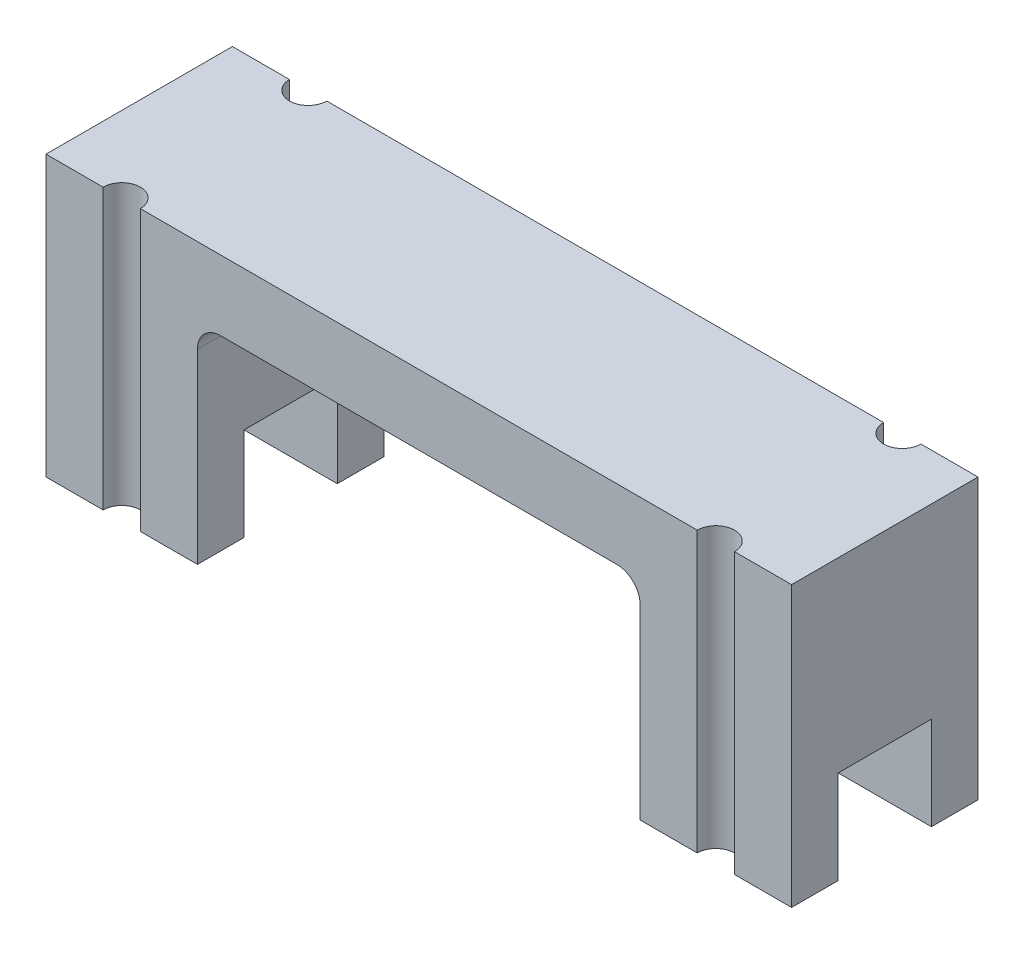
ISO-10303-21;
HEADER;
FILE_DESCRIPTION(('STEP AP214'),'2;1');
FILE_NAME('part.step','',(''),(''),'','','');
FILE_SCHEMA(('AUTOMOTIVE_DESIGN { 1 0 10303 214 1 1 1 1 }'));
ENDSEC;
DATA;
#1=APPLICATION_CONTEXT('core data for automotive mechanical design processes');
#2=APPLICATION_PROTOCOL_DEFINITION('international standard','automotive_design',2000,#1);
#3=PRODUCT_CONTEXT('',#1,'mechanical');
#4=PRODUCT('Part','Part','',(#3));
#5=PRODUCT_RELATED_PRODUCT_CATEGORY('part','',(#4));
#6=PRODUCT_DEFINITION_FORMATION('','',#4);
#7=PRODUCT_DEFINITION_CONTEXT('part definition',#1,'design');
#8=PRODUCT_DEFINITION('design','',#6,#7);
#9=PRODUCT_DEFINITION_SHAPE('','',#8);
#10=(LENGTH_UNIT() NAMED_UNIT(*) SI_UNIT(.MILLI.,.METRE.));
#11=(NAMED_UNIT(*) PLANE_ANGLE_UNIT() SI_UNIT($,.RADIAN.));
#12=(NAMED_UNIT(*) SI_UNIT($,.STERADIAN.) SOLID_ANGLE_UNIT());
#13=UNCERTAINTY_MEASURE_WITH_UNIT(LENGTH_MEASURE(1.E-05),#10,'distance_accuracy_value','');
#14=(GEOMETRIC_REPRESENTATION_CONTEXT(3) GLOBAL_UNCERTAINTY_ASSIGNED_CONTEXT((#13)) GLOBAL_UNIT_ASSIGNED_CONTEXT((#10,
#11,#12)) REPRESENTATION_CONTEXT('',''));
#15=CARTESIAN_POINT('',(0.,0.,0.));
#16=DIRECTION('',(0.,0.,1.));
#17=DIRECTION('',(1.,0.,0.));
#18=AXIS2_PLACEMENT_3D('',#15,#16,#17);
#19=CARTESIAN_POINT('',(-42.5,9.99999999999999,35.));
#20=DIRECTION('',(0.,0.,1.));
#21=DIRECTION('',(1.,0.,0.));
#22=AXIS2_PLACEMENT_3D('',#19,#20,#21);
#23=PLANE('',#22);
#24=DIRECTION('',(-1.,0.,0.));
#25=VECTOR('',#24,1.);
#26=CARTESIAN_POINT('',(80.,30.,35.));
#27=LINE('',#26,#25);
#28=CARTESIAN_POINT('',(80.,30.,35.));
#29=VERTEX_POINT('',#28);
#30=CARTESIAN_POINT('',(67.75,30.,35.));
#31=VERTEX_POINT('',#30);
#32=EDGE_CURVE('E278',#29,#31,#27,.T.);
#33=ORIENTED_EDGE('',*,*,#32,.T.);
#34=DIRECTION('',(0.,1.,0.));
#35=VECTOR('',#34,1.);
#36=CARTESIAN_POINT('',(67.75,-76.,35.));
#37=LINE('',#36,#35);
#38=CARTESIAN_POINT('',(67.75,-30.,35.));
#39=VERTEX_POINT('',#38);
#40=EDGE_CURVE('E11',#31,#39,#37,.F.);
#41=ORIENTED_EDGE('',*,*,#40,.T.);
#42=DIRECTION('',(1.,0.,0.));
#43=VECTOR('',#42,1.);
#44=CARTESIAN_POINT('',(47.5,-30.,35.));
#45=LINE('',#44,#43);
#46=CARTESIAN_POINT('',(80.,-30.,35.));
#47=VERTEX_POINT('',#46);
#48=EDGE_CURVE('E270',#39,#47,#45,.T.);
#49=ORIENTED_EDGE('',*,*,#48,.T.);
#50=DIRECTION('',(0.,1.,0.));
#51=VECTOR('',#50,1.);
#52=CARTESIAN_POINT('',(80.,-30.,35.));
#53=LINE('',#52,#51);
#54=EDGE_CURVE('E274',#47,#29,#53,.T.);
#55=ORIENTED_EDGE('',*,*,#54,.T.);
#56=EDGE_LOOP('',(#33,#41,#49,#55));
#57=FACE_BOUND('',#56,.T.);
#58=ADVANCED_FACE('F35',(#57),#23,.T.);
#59=CARTESIAN_POINT('',(47.5,-30.,35.));
#60=VERTEX_POINT('',#59);
#61=CARTESIAN_POINT('',(59.75,-30.,35.));
#62=VERTEX_POINT('',#61);
#63=EDGE_CURVE('E271',#60,#62,#45,.T.);
#64=ORIENTED_EDGE('',*,*,#63,.T.);
#65=DIRECTION('',(0.,1.,0.));
#66=VECTOR('',#65,1.);
#67=CARTESIAN_POINT('',(59.75,-76.,35.));
#68=LINE('',#67,#66);
#69=CARTESIAN_POINT('',(59.75,30.,35.));
#70=VERTEX_POINT('',#69);
#71=EDGE_CURVE('E43',#62,#70,#68,.T.);
#72=ORIENTED_EDGE('',*,*,#71,.T.);
#73=CARTESIAN_POINT('',(-59.75,30.,35.));
#74=VERTEX_POINT('',#73);
#75=EDGE_CURVE('E282',#70,#74,#27,.T.);
#76=ORIENTED_EDGE('',*,*,#75,.T.);
#77=DIRECTION('',(0.,1.,0.));
#78=VECTOR('',#77,1.);
#79=CARTESIAN_POINT('',(-59.75,-76.,35.));
#80=LINE('',#79,#78);
#81=CARTESIAN_POINT('',(-59.75,-30.,35.));
#82=VERTEX_POINT('',#81);
#83=EDGE_CURVE('E377',#74,#82,#80,.F.);
#84=ORIENTED_EDGE('',*,*,#83,.T.);
#85=DIRECTION('',(1.,0.,0.));
#86=VECTOR('',#85,1.);
#87=CARTESIAN_POINT('',(-80.,-30.,35.));
#88=LINE('',#87,#86);
#89=CARTESIAN_POINT('',(-47.5,-30.,35.));
#90=VERTEX_POINT('',#89);
#91=EDGE_CURVE('E251',#82,#90,#88,.T.);
#92=ORIENTED_EDGE('',*,*,#91,.T.);
#93=DIRECTION('',(0.,1.,0.));
#94=VECTOR('',#93,1.);
#95=CARTESIAN_POINT('',(-47.5,-30.,35.));
#96=LINE('',#95,#94);
#97=CARTESIAN_POINT('',(-47.5,9.99999999999997,35.));
#98=VERTEX_POINT('',#97);
#99=EDGE_CURVE('E255',#90,#98,#96,.T.);
#100=ORIENTED_EDGE('',*,*,#99,.T.);
#101=CARTESIAN_POINT('',(-42.5,9.99999999999999,35.));
#102=DIRECTION('',(0.,0.,-1.));
#103=DIRECTION('',(1.,0.,0.));
#104=AXIS2_PLACEMENT_3D('',#101,#102,#103);
#105=CIRCLE('',#104,5.);
#106=CARTESIAN_POINT('',(-42.5,15.,35.));
#107=VERTEX_POINT('',#106);
#108=EDGE_CURVE('E258',#98,#107,#105,.T.);
#109=ORIENTED_EDGE('',*,*,#108,.T.);
#110=DIRECTION('',(1.,0.,0.));
#111=VECTOR('',#110,1.);
#112=CARTESIAN_POINT('',(-42.5,15.,35.));
#113=LINE('',#112,#111);
#114=CARTESIAN_POINT('',(42.5,15.,35.));
#115=VERTEX_POINT('',#114);
#116=EDGE_CURVE('E261',#107,#115,#113,.T.);
#117=ORIENTED_EDGE('',*,*,#116,.T.);
#118=CARTESIAN_POINT('',(42.5,10.,35.));
#119=DIRECTION('',(0.,0.,-1.));
#120=DIRECTION('',(1.,0.,0.));
#121=AXIS2_PLACEMENT_3D('',#118,#119,#120);
#122=CIRCLE('',#121,5.);
#123=CARTESIAN_POINT('',(47.5,9.99999999999997,35.));
#124=VERTEX_POINT('',#123);
#125=EDGE_CURVE('E264',#115,#124,#122,.T.);
#126=ORIENTED_EDGE('',*,*,#125,.T.);
#127=DIRECTION('',(0.,-1.,0.));
#128=VECTOR('',#127,1.);
#129=CARTESIAN_POINT('',(47.5,9.99999999999997,35.));
#130=LINE('',#129,#128);
#131=EDGE_CURVE('E267',#124,#60,#130,.T.);
#132=ORIENTED_EDGE('',*,*,#131,.T.);
#133=EDGE_LOOP('',(#64,#72,#76,#84,#92,#100,#109,#117,#126,#132));
#134=FACE_BOUND('',#133,.T.);
#135=ADVANCED_FACE('F382',(#134),#23,.T.);
#136=CARTESIAN_POINT('',(-80.,-30.,35.));
#137=VERTEX_POINT('',#136);
#138=CARTESIAN_POINT('',(-67.75,-30.,35.));
#139=VERTEX_POINT('',#138);
#140=EDGE_CURVE('E252',#137,#139,#88,.T.);
#141=ORIENTED_EDGE('',*,*,#140,.T.);
#142=DIRECTION('',(0.,1.,0.));
#143=VECTOR('',#142,1.);
#144=CARTESIAN_POINT('',(-67.75,-76.,35.));
#145=LINE('',#144,#143);
#146=CARTESIAN_POINT('',(-67.75,30.,35.));
#147=VERTEX_POINT('',#146);
#148=EDGE_CURVE('E375',#139,#147,#145,.T.);
#149=ORIENTED_EDGE('',*,*,#148,.T.);
#150=CARTESIAN_POINT('',(-80.,30.,35.));
#151=VERTEX_POINT('',#150);
#152=EDGE_CURVE('E277',#147,#151,#27,.T.);
#153=ORIENTED_EDGE('',*,*,#152,.T.);
#154=DIRECTION('',(0.,-1.,0.));
#155=VECTOR('',#154,1.);
#156=CARTESIAN_POINT('',(-80.,30.,35.));
#157=LINE('',#156,#155);
#158=EDGE_CURVE('E281',#151,#137,#157,.T.);
#159=ORIENTED_EDGE('',*,*,#158,.T.);
#160=EDGE_LOOP('',(#141,#149,#153,#159));
#161=FACE_BOUND('',#160,.T.);
#162=ADVANCED_FACE('F391',(#161),#23,.T.);
#163=CARTESIAN_POINT('',(42.5,10.,-5.));
#164=DIRECTION('',(0.,0.,-1.));
#165=DIRECTION('',(-1.,0.,0.));
#166=AXIS2_PLACEMENT_3D('',#163,#164,#165);
#167=PLANE('',#166);
#168=DIRECTION('',(1.,0.,0.));
#169=VECTOR('',#168,1.);
#170=CARTESIAN_POINT('',(-80.,30.,-5.));
#171=LINE('',#170,#169);
#172=CARTESIAN_POINT('',(-59.75,30.,-5.));
#173=VERTEX_POINT('',#172);
#174=CARTESIAN_POINT('',(59.75,30.,-5.));
#175=VERTEX_POINT('',#174);
#176=EDGE_CURVE('E248',#173,#175,#171,.T.);
#177=ORIENTED_EDGE('',*,*,#176,.T.);
#178=DIRECTION('',(0.,1.,0.));
#179=VECTOR('',#178,1.);
#180=CARTESIAN_POINT('',(59.75,-76.,-5.));
#181=LINE('',#180,#179);
#182=CARTESIAN_POINT('',(59.75,-30.,-5.));
#183=VERTEX_POINT('',#182);
#184=EDGE_CURVE('E372',#175,#183,#181,.F.);
#185=ORIENTED_EDGE('',*,*,#184,.T.);
#186=DIRECTION('',(-1.,0.,0.));
#187=VECTOR('',#186,1.);
#188=CARTESIAN_POINT('',(80.,-30.,-5.));
#189=LINE('',#188,#187);
#190=CARTESIAN_POINT('',(47.5,-30.,-5.));
#191=VERTEX_POINT('',#190);
#192=EDGE_CURVE('E414',#183,#191,#189,.T.);
#193=ORIENTED_EDGE('',*,*,#192,.T.);
#194=DIRECTION('',(0.,1.,0.));
#195=VECTOR('',#194,1.);
#196=CARTESIAN_POINT('',(47.5,-30.,-5.));
#197=LINE('',#196,#195);
#198=CARTESIAN_POINT('',(47.5,10.,-5.));
#199=VERTEX_POINT('',#198);
#200=EDGE_CURVE('E418',#191,#199,#197,.T.);
#201=ORIENTED_EDGE('',*,*,#200,.T.);
#202=CARTESIAN_POINT('',(42.5,10.,-5.));
#203=DIRECTION('',(0.,0.,1.));
#204=DIRECTION('',(-1.,0.,0.));
#205=AXIS2_PLACEMENT_3D('',#202,#203,#204);
#206=CIRCLE('',#205,5.);
#207=CARTESIAN_POINT('',(42.5,15.,-5.));
#208=VERTEX_POINT('',#207);
#209=EDGE_CURVE('E421',#199,#208,#206,.T.);
#210=ORIENTED_EDGE('',*,*,#209,.T.);
#211=DIRECTION('',(-1.,0.,0.));
#212=VECTOR('',#211,1.);
#213=CARTESIAN_POINT('',(42.5,15.,-5.));
#214=LINE('',#213,#212);
#215=CARTESIAN_POINT('',(-42.5,15.,-5.));
#216=VERTEX_POINT('',#215);
#217=EDGE_CURVE('E424',#208,#216,#214,.T.);
#218=ORIENTED_EDGE('',*,*,#217,.T.);
#219=CARTESIAN_POINT('',(-42.5,9.99999999999999,-5.));
#220=DIRECTION('',(0.,0.,1.));
#221=DIRECTION('',(-1.,0.,0.));
#222=AXIS2_PLACEMENT_3D('',#219,#220,#221);
#223=CIRCLE('',#222,5.);
#224=CARTESIAN_POINT('',(-47.5,9.99999999999999,-5.));
#225=VERTEX_POINT('',#224);
#226=EDGE_CURVE('E426',#216,#225,#223,.T.);
#227=ORIENTED_EDGE('',*,*,#226,.T.);
#228=DIRECTION('',(0.,-1.,0.));
#229=VECTOR('',#228,1.);
#230=CARTESIAN_POINT('',(-47.5,9.99999999999999,-5.));
#231=LINE('',#230,#229);
#232=CARTESIAN_POINT('',(-47.5,-30.,-5.));
#233=VERTEX_POINT('',#232);
#234=EDGE_CURVE('E235',#225,#233,#231,.T.);
#235=ORIENTED_EDGE('',*,*,#234,.T.);
#236=DIRECTION('',(-1.,0.,0.));
#237=VECTOR('',#236,1.);
#238=CARTESIAN_POINT('',(-47.5,-30.,-5.));
#239=LINE('',#238,#237);
#240=CARTESIAN_POINT('',(-59.75,-30.,-5.));
#241=VERTEX_POINT('',#240);
#242=EDGE_CURVE('E226',#233,#241,#239,.T.);
#243=ORIENTED_EDGE('',*,*,#242,.T.);
#244=DIRECTION('',(0.,1.,0.));
#245=VECTOR('',#244,1.);
#246=CARTESIAN_POINT('',(-59.75,-76.,-5.));
#247=LINE('',#246,#245);
#248=EDGE_CURVE('E207',#241,#173,#247,.T.);
#249=ORIENTED_EDGE('',*,*,#248,.T.);
#250=EDGE_LOOP('',(#177,#185,#193,#201,#210,#218,#227,#235,#243,#249));
#251=FACE_BOUND('',#250,.T.);
#252=ADVANCED_FACE('F232',(#251),#167,.T.);
#253=CARTESIAN_POINT('',(80.,-30.,-5.));
#254=VERTEX_POINT('',#253);
#255=CARTESIAN_POINT('',(67.75,-30.,-5.));
#256=VERTEX_POINT('',#255);
#257=EDGE_CURVE('E415',#254,#256,#189,.T.);
#258=ORIENTED_EDGE('',*,*,#257,.T.);
#259=DIRECTION('',(0.,1.,0.));
#260=VECTOR('',#259,1.);
#261=CARTESIAN_POINT('',(67.75,-76.,-5.));
#262=LINE('',#261,#260);
#263=CARTESIAN_POINT('',(67.75,30.,-5.));
#264=VERTEX_POINT('',#263);
#265=EDGE_CURVE('E369',#256,#264,#262,.T.);
#266=ORIENTED_EDGE('',*,*,#265,.T.);
#267=CARTESIAN_POINT('',(80.,30.,-5.));
#268=VERTEX_POINT('',#267);
#269=EDGE_CURVE('E239',#264,#268,#171,.T.);
#270=ORIENTED_EDGE('',*,*,#269,.T.);
#271=DIRECTION('',(0.,-1.,0.));
#272=VECTOR('',#271,1.);
#273=CARTESIAN_POINT('',(80.,30.,-5.));
#274=LINE('',#273,#272);
#275=EDGE_CURVE('E247',#268,#254,#274,.T.);
#276=ORIENTED_EDGE('',*,*,#275,.T.);
#277=EDGE_LOOP('',(#258,#266,#270,#276));
#278=FACE_BOUND('',#277,.T.);
#279=ADVANCED_FACE('F482',(#278),#167,.T.);
#280=CARTESIAN_POINT('',(-80.,30.,-5.));
#281=VERTEX_POINT('',#280);
#282=CARTESIAN_POINT('',(-67.75,30.,-5.));
#283=VERTEX_POINT('',#282);
#284=EDGE_CURVE('E244',#281,#283,#171,.T.);
#285=ORIENTED_EDGE('',*,*,#284,.T.);
#286=DIRECTION('',(0.,1.,0.));
#287=VECTOR('',#286,1.);
#288=CARTESIAN_POINT('',(-67.75,-76.,-5.));
#289=LINE('',#288,#287);
#290=CARTESIAN_POINT('',(-67.75,-30.,-5.));
#291=VERTEX_POINT('',#290);
#292=EDGE_CURVE('E218',#283,#291,#289,.F.);
#293=ORIENTED_EDGE('',*,*,#292,.T.);
#294=CARTESIAN_POINT('',(-80.,-30.,-5.));
#295=VERTEX_POINT('',#294);
#296=EDGE_CURVE('E228',#291,#295,#239,.T.);
#297=ORIENTED_EDGE('',*,*,#296,.T.);
#298=DIRECTION('',(0.,1.,0.));
#299=VECTOR('',#298,1.);
#300=CARTESIAN_POINT('',(-80.,-30.,-5.));
#301=LINE('',#300,#299);
#302=EDGE_CURVE('E236',#295,#281,#301,.T.);
#303=ORIENTED_EDGE('',*,*,#302,.T.);
#304=EDGE_LOOP('',(#285,#293,#297,#303));
#305=FACE_BOUND('',#304,.T.);
#306=ADVANCED_FACE('F439',(#305),#167,.T.);
#307=CARTESIAN_POINT('',(-80.,-30.,30.));
#308=DIRECTION('',(0.,1.,0.));
#309=DIRECTION('',(0.,0.,1.));
#310=AXIS2_PLACEMENT_3D('',#307,#308,#309);
#311=PLANE('',#310);
#312=CARTESIAN_POINT('',(-63.75,-30.,-5.));
#313=DIRECTION('',(0.,1.,0.));
#314=DIRECTION('',(0.,0.,1.));
#315=AXIS2_PLACEMENT_3D('',#312,#313,#314);
#316=CIRCLE('',#315,4.00000000000001);
#317=EDGE_CURVE('E210',#241,#291,#316,.F.);
#318=ORIENTED_EDGE('',*,*,#317,.F.);
#319=ORIENTED_EDGE('',*,*,#242,.F.);
#320=DIRECTION('',(0.,0.,1.));
#321=VECTOR('',#320,1.);
#322=CARTESIAN_POINT('',(-47.5,-30.,30.));
#323=LINE('',#322,#321);
#324=CARTESIAN_POINT('',(-47.5,-30.,5.));
#325=VERTEX_POINT('',#324);
#326=EDGE_CURVE('E306',#233,#325,#323,.T.);
#327=ORIENTED_EDGE('',*,*,#326,.T.);
#328=DIRECTION('',(-1.,0.,0.));
#329=VECTOR('',#328,1.);
#330=CARTESIAN_POINT('',(-80.,-30.,5.));
#331=LINE('',#330,#329);
#332=CARTESIAN_POINT('',(-80.,-30.,5.));
#333=VERTEX_POINT('',#332);
#334=EDGE_CURVE('E351',#325,#333,#331,.T.);
#335=ORIENTED_EDGE('',*,*,#334,.T.);
#336=DIRECTION('',(0.,0.,-1.));
#337=VECTOR('',#336,1.);
#338=CARTESIAN_POINT('',(-80.,-30.,30.));
#339=LINE('',#338,#337);
#340=EDGE_CURVE('E338',#333,#295,#339,.T.);
#341=ORIENTED_EDGE('',*,*,#340,.T.);
#342=ORIENTED_EDGE('',*,*,#296,.F.);
#343=EDGE_LOOP('',(#318,#319,#327,#335,#341,#342));
#344=FACE_BOUND('',#343,.T.);
#345=ADVANCED_FACE('F224',(#344),#311,.F.);
#346=CARTESIAN_POINT('',(-63.75,-30.,35.));
#347=DIRECTION('',(0.,1.,0.));
#348=DIRECTION('',(0.,0.,1.));
#349=AXIS2_PLACEMENT_3D('',#346,#347,#348);
#350=CIRCLE('',#349,4.00000000000001);
#351=EDGE_CURVE('E405',#139,#82,#350,.F.);
#352=ORIENTED_EDGE('',*,*,#351,.F.);
#353=ORIENTED_EDGE('',*,*,#140,.F.);
#354=CARTESIAN_POINT('',(-80.,-30.,25.));
#355=VERTEX_POINT('',#354);
#356=EDGE_CURVE('E339',#137,#355,#339,.T.);
#357=ORIENTED_EDGE('',*,*,#356,.T.);
#358=DIRECTION('',(1.,0.,0.));
#359=VECTOR('',#358,1.);
#360=CARTESIAN_POINT('',(-80.,-30.,25.));
#361=LINE('',#360,#359);
#362=CARTESIAN_POINT('',(-47.5,-30.,25.));
#363=VERTEX_POINT('',#362);
#364=EDGE_CURVE('E348',#355,#363,#361,.T.);
#365=ORIENTED_EDGE('',*,*,#364,.T.);
#366=DIRECTION('',(0.,0.,1.));
#367=VECTOR('',#366,1.);
#368=CARTESIAN_POINT('',(-47.5,-30.,30.));
#369=LINE('',#368,#367);
#370=EDGE_CURVE('E300',#363,#90,#369,.T.);
#371=ORIENTED_EDGE('',*,*,#370,.T.);
#372=ORIENTED_EDGE('',*,*,#91,.F.);
#373=EDGE_LOOP('',(#352,#353,#357,#365,#371,#372));
#374=FACE_BOUND('',#373,.T.);
#375=ADVANCED_FACE('F403',(#374),#311,.F.);
#376=CARTESIAN_POINT('',(91.0000000000001,-10.,25.));
#377=DIRECTION('',(0.,1.,0.));
#378=DIRECTION('',(0.,0.,1.));
#379=AXIS2_PLACEMENT_3D('',#376,#377,#378);
#380=PLANE('',#379);
#381=DIRECTION('',(-1.,0.,0.));
#382=VECTOR('',#381,1.);
#383=CARTESIAN_POINT('',(91.0000000000001,-10.,5.));
#384=LINE('',#383,#382);
#385=CARTESIAN_POINT('',(-47.5,-10.,5.));
#386=VERTEX_POINT('',#385);
#387=CARTESIAN_POINT('',(-80.,-10.,5.));
#388=VERTEX_POINT('',#387);
#389=EDGE_CURVE('E322',#386,#388,#384,.T.);
#390=ORIENTED_EDGE('',*,*,#389,.F.);
#391=DIRECTION('',(0.,0.,1.));
#392=VECTOR('',#391,1.);
#393=CARTESIAN_POINT('',(-47.5,-10.,25.));
#394=LINE('',#393,#392);
#395=CARTESIAN_POINT('',(-47.5,-10.,25.));
#396=VERTEX_POINT('',#395);
#397=EDGE_CURVE('E297',#386,#396,#394,.T.);
#398=ORIENTED_EDGE('',*,*,#397,.T.);
#399=DIRECTION('',(-1.,0.,0.));
#400=VECTOR('',#399,1.);
#401=CARTESIAN_POINT('',(91.0000000000001,-10.,25.));
#402=LINE('',#401,#400);
#403=CARTESIAN_POINT('',(-80.,-10.,25.));
#404=VERTEX_POINT('',#403);
#405=EDGE_CURVE('E317',#396,#404,#402,.T.);
#406=ORIENTED_EDGE('',*,*,#405,.T.);
#407=DIRECTION('',(0.,0.,-1.));
#408=VECTOR('',#407,1.);
#409=CARTESIAN_POINT('',(-80.,-10.,25.));
#410=LINE('',#409,#408);
#411=EDGE_CURVE('E314',#404,#388,#410,.T.);
#412=ORIENTED_EDGE('',*,*,#411,.T.);
#413=EDGE_LOOP('',(#390,#398,#406,#412));
#414=FACE_BOUND('',#413,.T.);
#415=ADVANCED_FACE('F497',(#414),#380,.F.);
#416=CARTESIAN_POINT('',(91.0000000000001,-50.,5.));
#417=DIRECTION('',(0.,0.,-1.));
#418=DIRECTION('',(-1.,0.,0.));
#419=AXIS2_PLACEMENT_3D('',#416,#417,#418);
#420=PLANE('',#419);
#421=ORIENTED_EDGE('',*,*,#334,.F.);
#422=DIRECTION('',(0.,1.,0.));
#423=VECTOR('',#422,1.);
#424=CARTESIAN_POINT('',(-47.5,-50.,5.));
#425=LINE('',#424,#423);
#426=EDGE_CURVE('E303',#325,#386,#425,.T.);
#427=ORIENTED_EDGE('',*,*,#426,.T.);
#428=ORIENTED_EDGE('',*,*,#389,.T.);
#429=DIRECTION('',(0.,-1.,0.));
#430=VECTOR('',#429,1.);
#431=CARTESIAN_POINT('',(-80.,-50.,5.));
#432=LINE('',#431,#430);
#433=EDGE_CURVE('E308',#388,#333,#432,.T.);
#434=ORIENTED_EDGE('',*,*,#433,.T.);
#435=EDGE_LOOP('',(#421,#427,#428,#434));
#436=FACE_BOUND('',#435,.T.);
#437=ADVANCED_FACE('F435',(#436),#420,.F.);
#438=CARTESIAN_POINT('',(91.0000000000001,-50.,25.));
#439=DIRECTION('',(0.,0.,1.));
#440=DIRECTION('',(1.,0.,0.));
#441=AXIS2_PLACEMENT_3D('',#438,#439,#440);
#442=PLANE('',#441);
#443=ORIENTED_EDGE('',*,*,#405,.F.);
#444=DIRECTION('',(0.,-1.,0.));
#445=VECTOR('',#444,1.);
#446=CARTESIAN_POINT('',(-47.5,-50.,25.));
#447=LINE('',#446,#445);
#448=EDGE_CURVE('E358',#396,#363,#447,.T.);
#449=ORIENTED_EDGE('',*,*,#448,.T.);
#450=ORIENTED_EDGE('',*,*,#364,.F.);
#451=DIRECTION('',(0.,1.,0.));
#452=VECTOR('',#451,1.);
#453=CARTESIAN_POINT('',(-80.,-50.,25.));
#454=LINE('',#453,#452);
#455=EDGE_CURVE('E311',#355,#404,#454,.T.);
#456=ORIENTED_EDGE('',*,*,#455,.T.);
#457=EDGE_LOOP('',(#443,#449,#450,#456));
#458=FACE_BOUND('',#457,.T.);
#459=ADVANCED_FACE('F514',(#458),#442,.F.);
#460=CARTESIAN_POINT('',(63.75,-30.,-5.));
#461=DIRECTION('',(0.,1.,0.));
#462=DIRECTION('',(0.,0.,1.));
#463=AXIS2_PLACEMENT_3D('',#460,#461,#462);
#464=CIRCLE('',#463,4.00000000000001);
#465=EDGE_CURVE('E409',#256,#183,#464,.F.);
#466=ORIENTED_EDGE('',*,*,#465,.F.);
#467=ORIENTED_EDGE('',*,*,#257,.F.);
#468=DIRECTION('',(0.,0.,-1.));
#469=VECTOR('',#468,1.);
#470=CARTESIAN_POINT('',(80.,-30.,30.));
#471=LINE('',#470,#469);
#472=CARTESIAN_POINT('',(80.,-30.,5.));
#473=VERTEX_POINT('',#472);
#474=EDGE_CURVE('E334',#473,#254,#471,.T.);
#475=ORIENTED_EDGE('',*,*,#474,.F.);
#476=CARTESIAN_POINT('',(47.5,-30.,5.));
#477=VERTEX_POINT('',#476);
#478=EDGE_CURVE('E352',#473,#477,#331,.T.);
#479=ORIENTED_EDGE('',*,*,#478,.T.);
#480=DIRECTION('',(0.,0.,-1.));
#481=VECTOR('',#480,1.);
#482=CARTESIAN_POINT('',(47.5,-30.,30.));
#483=LINE('',#482,#481);
#484=EDGE_CURVE('E294',#477,#191,#483,.T.);
#485=ORIENTED_EDGE('',*,*,#484,.T.);
#486=ORIENTED_EDGE('',*,*,#192,.F.);
#487=EDGE_LOOP('',(#466,#467,#475,#479,#485,#486));
#488=FACE_BOUND('',#487,.T.);
#489=ADVANCED_FACE('F449',(#488),#311,.F.);
#490=CARTESIAN_POINT('',(80.,30.,30.));
#491=DIRECTION('',(-1.,0.,0.));
#492=DIRECTION('',(0.,0.,1.));
#493=AXIS2_PLACEMENT_3D('',#490,#491,#492);
#494=PLANE('',#493);
#495=DIRECTION('',(0.,0.,-1.));
#496=VECTOR('',#495,1.);
#497=CARTESIAN_POINT('',(80.,-10.,30.));
#498=LINE('',#497,#496);
#499=CARTESIAN_POINT('',(80.,-10.,25.));
#500=VERTEX_POINT('',#499);
#501=CARTESIAN_POINT('',(80.,-10.,5.));
#502=VERTEX_POINT('',#501);
#503=EDGE_CURVE('E331',#500,#502,#498,.T.);
#504=ORIENTED_EDGE('',*,*,#503,.T.);
#505=DIRECTION('',(0.,-1.,0.));
#506=VECTOR('',#505,1.);
#507=CARTESIAN_POINT('',(80.,30.,5.));
#508=LINE('',#507,#506);
#509=EDGE_CURVE('E328',#502,#473,#508,.T.);
#510=ORIENTED_EDGE('',*,*,#509,.T.);
#511=ORIENTED_EDGE('',*,*,#474,.T.);
#512=ORIENTED_EDGE('',*,*,#275,.F.);
#513=DIRECTION('',(0.,0.,-1.));
#514=VECTOR('',#513,1.);
#515=CARTESIAN_POINT('',(80.,30.,30.));
#516=LINE('',#515,#514);
#517=EDGE_CURVE('E344',#29,#268,#516,.T.);
#518=ORIENTED_EDGE('',*,*,#517,.F.);
#519=ORIENTED_EDGE('',*,*,#54,.F.);
#520=CARTESIAN_POINT('',(80.,-30.,25.));
#521=VERTEX_POINT('',#520);
#522=EDGE_CURVE('E335',#47,#521,#471,.T.);
#523=ORIENTED_EDGE('',*,*,#522,.T.);
#524=DIRECTION('',(0.,1.,0.));
#525=VECTOR('',#524,1.);
#526=CARTESIAN_POINT('',(80.,30.,25.));
#527=LINE('',#526,#525);
#528=EDGE_CURVE('E321',#521,#500,#527,.T.);
#529=ORIENTED_EDGE('',*,*,#528,.T.);
#530=EDGE_LOOP('',(#504,#510,#511,#512,#518,#519,#523,#529));
#531=FACE_BOUND('',#530,.T.);
#532=ADVANCED_FACE('F513',(#531),#494,.F.);
#533=CARTESIAN_POINT('',(-80.,30.,30.));
#534=DIRECTION('',(0.,-1.,0.));
#535=DIRECTION('',(1.,0.,0.));
#536=AXIS2_PLACEMENT_3D('',#533,#534,#535);
#537=PLANE('',#536);
#538=CARTESIAN_POINT('',(63.75,30.,35.));
#539=DIRECTION('',(0.,-1.,0.));
#540=DIRECTION('',(1.,0.,0.));
#541=AXIS2_PLACEMENT_3D('',#538,#539,#540);
#542=CIRCLE('',#541,4.00000000000001);
#543=EDGE_CURVE('E58',#31,#70,#542,.F.);
#544=ORIENTED_EDGE('',*,*,#543,.F.);
#545=ORIENTED_EDGE('',*,*,#32,.F.);
#546=ORIENTED_EDGE('',*,*,#517,.T.);
#547=ORIENTED_EDGE('',*,*,#269,.F.);
#548=CARTESIAN_POINT('',(63.75,30.,-5.));
#549=DIRECTION('',(0.,-1.,0.));
#550=DIRECTION('',(1.,0.,0.));
#551=AXIS2_PLACEMENT_3D('',#548,#549,#550);
#552=CIRCLE('',#551,4.00000000000001);
#553=EDGE_CURVE('E229',#175,#264,#552,.F.);
#554=ORIENTED_EDGE('',*,*,#553,.F.);
#555=ORIENTED_EDGE('',*,*,#176,.F.);
#556=CARTESIAN_POINT('',(-63.75,30.,-5.));
#557=DIRECTION('',(0.,-1.,0.));
#558=DIRECTION('',(1.,0.,0.));
#559=AXIS2_PLACEMENT_3D('',#556,#557,#558);
#560=CIRCLE('',#559,4.00000000000001);
#561=EDGE_CURVE('E213',#283,#173,#560,.F.);
#562=ORIENTED_EDGE('',*,*,#561,.F.);
#563=ORIENTED_EDGE('',*,*,#284,.F.);
#564=DIRECTION('',(0.,0.,-1.));
#565=VECTOR('',#564,1.);
#566=CARTESIAN_POINT('',(-80.,30.,30.));
#567=LINE('',#566,#565);
#568=EDGE_CURVE('E342',#151,#281,#567,.T.);
#569=ORIENTED_EDGE('',*,*,#568,.F.);
#570=ORIENTED_EDGE('',*,*,#152,.F.);
#571=CARTESIAN_POINT('',(-63.75,30.,35.));
#572=DIRECTION('',(0.,-1.,0.));
#573=DIRECTION('',(1.,0.,0.));
#574=AXIS2_PLACEMENT_3D('',#571,#572,#573);
#575=CIRCLE('',#574,4.00000000000001);
#576=EDGE_CURVE('E50',#74,#147,#575,.F.);
#577=ORIENTED_EDGE('',*,*,#576,.F.);
#578=ORIENTED_EDGE('',*,*,#75,.F.);
#579=EDGE_LOOP('',(#544,#545,#546,#547,#554,#555,#562,#563,#569,#570,#577,#578));
#580=FACE_BOUND('',#579,.T.);
#581=ADVANCED_FACE('F386',(#580),#537,.F.);
#582=CARTESIAN_POINT('',(-80.,30.,30.));
#583=DIRECTION('',(1.,0.,0.));
#584=DIRECTION('',(0.,0.,-1.));
#585=AXIS2_PLACEMENT_3D('',#582,#583,#584);
#586=PLANE('',#585);
#587=ORIENTED_EDGE('',*,*,#340,.F.);
#588=ORIENTED_EDGE('',*,*,#433,.F.);
#589=ORIENTED_EDGE('',*,*,#411,.F.);
#590=ORIENTED_EDGE('',*,*,#455,.F.);
#591=ORIENTED_EDGE('',*,*,#356,.F.);
#592=ORIENTED_EDGE('',*,*,#158,.F.);
#593=ORIENTED_EDGE('',*,*,#568,.T.);
#594=ORIENTED_EDGE('',*,*,#302,.F.);
#595=EDGE_LOOP('',(#587,#588,#589,#590,#591,#592,#593,#594));
#596=FACE_BOUND('',#595,.T.);
#597=ADVANCED_FACE('F398',(#596),#586,.F.);
#598=CARTESIAN_POINT('',(63.75,-30.,35.));
#599=DIRECTION('',(0.,1.,0.));
#600=DIRECTION('',(0.,0.,1.));
#601=AXIS2_PLACEMENT_3D('',#598,#599,#600);
#602=CIRCLE('',#601,4.00000000000001);
#603=EDGE_CURVE('E406',#62,#39,#602,.F.);
#604=ORIENTED_EDGE('',*,*,#603,.F.);
#605=ORIENTED_EDGE('',*,*,#63,.F.);
#606=DIRECTION('',(0.,0.,-1.));
#607=VECTOR('',#606,1.);
#608=CARTESIAN_POINT('',(47.5,-30.,30.));
#609=LINE('',#608,#607);
#610=CARTESIAN_POINT('',(47.5,-30.,25.));
#611=VERTEX_POINT('',#610);
#612=EDGE_CURVE('E288',#60,#611,#609,.T.);
#613=ORIENTED_EDGE('',*,*,#612,.T.);
#614=EDGE_CURVE('E347',#611,#521,#361,.T.);
#615=ORIENTED_EDGE('',*,*,#614,.T.);
#616=ORIENTED_EDGE('',*,*,#522,.F.);
#617=ORIENTED_EDGE('',*,*,#48,.F.);
#618=EDGE_LOOP('',(#604,#605,#613,#615,#616,#617));
#619=FACE_BOUND('',#618,.T.);
#620=ADVANCED_FACE('F493',(#619),#311,.F.);
#621=CARTESIAN_POINT('',(47.5,-10.,25.));
#622=VERTEX_POINT('',#621);
#623=EDGE_CURVE('E323',#500,#622,#402,.T.);
#624=ORIENTED_EDGE('',*,*,#623,.T.);
#625=DIRECTION('',(0.,0.,-1.));
#626=VECTOR('',#625,1.);
#627=CARTESIAN_POINT('',(47.5,-10.,25.));
#628=LINE('',#627,#626);
#629=CARTESIAN_POINT('',(47.5,-10.,5.));
#630=VERTEX_POINT('',#629);
#631=EDGE_CURVE('E285',#622,#630,#628,.T.);
#632=ORIENTED_EDGE('',*,*,#631,.T.);
#633=EDGE_CURVE('E318',#502,#630,#384,.T.);
#634=ORIENTED_EDGE('',*,*,#633,.F.);
#635=ORIENTED_EDGE('',*,*,#503,.F.);
#636=EDGE_LOOP('',(#624,#632,#634,#635));
#637=FACE_BOUND('',#636,.T.);
#638=ADVANCED_FACE('F501',(#637),#380,.F.);
#639=ORIENTED_EDGE('',*,*,#633,.T.);
#640=DIRECTION('',(0.,-1.,0.));
#641=VECTOR('',#640,1.);
#642=CARTESIAN_POINT('',(47.5,-50.,5.));
#643=LINE('',#642,#641);
#644=EDGE_CURVE('E291',#630,#477,#643,.T.);
#645=ORIENTED_EDGE('',*,*,#644,.T.);
#646=ORIENTED_EDGE('',*,*,#478,.F.);
#647=ORIENTED_EDGE('',*,*,#509,.F.);
#648=EDGE_LOOP('',(#639,#645,#646,#647));
#649=FACE_BOUND('',#648,.T.);
#650=ADVANCED_FACE('F508',(#649),#420,.F.);
#651=ORIENTED_EDGE('',*,*,#614,.F.);
#652=DIRECTION('',(0.,1.,0.));
#653=VECTOR('',#652,1.);
#654=CARTESIAN_POINT('',(47.5,-50.,25.));
#655=LINE('',#654,#653);
#656=EDGE_CURVE('E355',#611,#622,#655,.T.);
#657=ORIENTED_EDGE('',*,*,#656,.T.);
#658=ORIENTED_EDGE('',*,*,#623,.F.);
#659=ORIENTED_EDGE('',*,*,#528,.F.);
#660=EDGE_LOOP('',(#651,#657,#658,#659));
#661=FACE_BOUND('',#660,.T.);
#662=ADVANCED_FACE('F523',(#661),#442,.F.);
#663=CARTESIAN_POINT('',(47.5,15.,-141.));
#664=DIRECTION('',(0.,1.,0.));
#665=DIRECTION('',(0.,0.,1.));
#666=AXIS2_PLACEMENT_3D('',#663,#664,#665);
#667=PLANE('',#666);
#668=DIRECTION('',(0.,0.,1.));
#669=VECTOR('',#668,1.);
#670=CARTESIAN_POINT('',(-42.5,15.,0.));
#671=LINE('',#670,#669);
#672=EDGE_CURVE('E361',#107,#216,#671,.F.);
#673=ORIENTED_EDGE('',*,*,#672,.T.);
#674=ORIENTED_EDGE('',*,*,#217,.F.);
#675=DIRECTION('',(0.,0.,1.));
#676=VECTOR('',#675,1.);
#677=CARTESIAN_POINT('',(42.5,15.,30.));
#678=LINE('',#677,#676);
#679=EDGE_CURVE('E363',#208,#115,#678,.T.);
#680=ORIENTED_EDGE('',*,*,#679,.T.);
#681=ORIENTED_EDGE('',*,*,#116,.F.);
#682=EDGE_LOOP('',(#673,#674,#680,#681));
#683=FACE_BOUND('',#682,.T.);
#684=ADVANCED_FACE('F461',(#683),#667,.F.);
#685=CARTESIAN_POINT('',(-47.5,-75.,-141.));
#686=DIRECTION('',(-1.,0.,0.));
#687=DIRECTION('',(0.,0.,1.));
#688=AXIS2_PLACEMENT_3D('',#685,#686,#687);
#689=PLANE('',#688);
#690=ORIENTED_EDGE('',*,*,#326,.F.);
#691=ORIENTED_EDGE('',*,*,#234,.F.);
#692=DIRECTION('',(0.,0.,1.));
#693=VECTOR('',#692,1.);
#694=CARTESIAN_POINT('',(-47.5,9.99999999999999,30.));
#695=LINE('',#694,#693);
#696=EDGE_CURVE('E219',#225,#98,#695,.T.);
#697=ORIENTED_EDGE('',*,*,#696,.T.);
#698=ORIENTED_EDGE('',*,*,#99,.F.);
#699=ORIENTED_EDGE('',*,*,#370,.F.);
#700=ORIENTED_EDGE('',*,*,#448,.F.);
#701=ORIENTED_EDGE('',*,*,#397,.F.);
#702=ORIENTED_EDGE('',*,*,#426,.F.);
#703=EDGE_LOOP('',(#690,#691,#697,#698,#699,#700,#701,#702));
#704=FACE_BOUND('',#703,.T.);
#705=ADVANCED_FACE('F431',(#704),#689,.F.);
#706=CARTESIAN_POINT('',(47.5,-75.,-141.));
#707=DIRECTION('',(1.,0.,0.));
#708=DIRECTION('',(0.,0.,-1.));
#709=AXIS2_PLACEMENT_3D('',#706,#707,#708);
#710=PLANE('',#709);
#711=ORIENTED_EDGE('',*,*,#612,.F.);
#712=ORIENTED_EDGE('',*,*,#131,.F.);
#713=DIRECTION('',(0.,0.,1.));
#714=VECTOR('',#713,1.);
#715=CARTESIAN_POINT('',(47.5,10.,0.));
#716=LINE('',#715,#714);
#717=EDGE_CURVE('E365',#124,#199,#716,.F.);
#718=ORIENTED_EDGE('',*,*,#717,.T.);
#719=ORIENTED_EDGE('',*,*,#200,.F.);
#720=ORIENTED_EDGE('',*,*,#484,.F.);
#721=ORIENTED_EDGE('',*,*,#644,.F.);
#722=ORIENTED_EDGE('',*,*,#631,.F.);
#723=ORIENTED_EDGE('',*,*,#656,.F.);
#724=EDGE_LOOP('',(#711,#712,#718,#719,#720,#721,#722,#723));
#725=FACE_BOUND('',#724,.T.);
#726=ADVANCED_FACE('F453',(#725),#710,.F.);
#727=CARTESIAN_POINT('',(42.5,10.,-141.));
#728=DIRECTION('',(0.,0.,-1.));
#729=DIRECTION('',(-1.,0.,0.));
#730=AXIS2_PLACEMENT_3D('',#727,#728,#729);
#731=CYLINDRICAL_SURFACE('',#730,5.);
#732=ORIENTED_EDGE('',*,*,#679,.F.);
#733=ORIENTED_EDGE('',*,*,#209,.F.);
#734=ORIENTED_EDGE('',*,*,#717,.F.);
#735=ORIENTED_EDGE('',*,*,#125,.F.);
#736=EDGE_LOOP('',(#732,#733,#734,#735));
#737=FACE_BOUND('',#736,.T.);
#738=ADVANCED_FACE('F457',(#737),#731,.F.);
#739=CARTESIAN_POINT('',(-42.5,9.99999999999999,-141.));
#740=DIRECTION('',(0.,0.,-1.));
#741=DIRECTION('',(-1.,0.,0.));
#742=AXIS2_PLACEMENT_3D('',#739,#740,#741);
#743=CYLINDRICAL_SURFACE('',#742,5.);
#744=ORIENTED_EDGE('',*,*,#696,.F.);
#745=ORIENTED_EDGE('',*,*,#226,.F.);
#746=ORIENTED_EDGE('',*,*,#672,.F.);
#747=ORIENTED_EDGE('',*,*,#108,.F.);
#748=EDGE_LOOP('',(#744,#745,#746,#747));
#749=FACE_BOUND('',#748,.T.);
#750=ADVANCED_FACE('F37',(#749),#743,.F.);
#751=CARTESIAN_POINT('',(-63.75,-76.,-5.));
#752=DIRECTION('',(0.,1.,0.));
#753=DIRECTION('',(0.,0.,1.));
#754=AXIS2_PLACEMENT_3D('',#751,#752,#753);
#755=CYLINDRICAL_SURFACE('',#754,4.00000000000001);
#756=ORIENTED_EDGE('',*,*,#561,.T.);
#757=ORIENTED_EDGE('',*,*,#248,.F.);
#758=ORIENTED_EDGE('',*,*,#317,.T.);
#759=ORIENTED_EDGE('',*,*,#292,.F.);
#760=EDGE_LOOP('',(#756,#757,#758,#759));
#761=FACE_BOUND('',#760,.T.);
#762=ADVANCED_FACE('F209',(#761),#755,.F.);
#763=CARTESIAN_POINT('',(63.75,-76.,-5.));
#764=DIRECTION('',(0.,1.,0.));
#765=DIRECTION('',(0.,0.,1.));
#766=AXIS2_PLACEMENT_3D('',#763,#764,#765);
#767=CYLINDRICAL_SURFACE('',#766,4.00000000000001);
#768=ORIENTED_EDGE('',*,*,#553,.T.);
#769=ORIENTED_EDGE('',*,*,#265,.F.);
#770=ORIENTED_EDGE('',*,*,#465,.T.);
#771=ORIENTED_EDGE('',*,*,#184,.F.);
#772=EDGE_LOOP('',(#768,#769,#770,#771));
#773=FACE_BOUND('',#772,.T.);
#774=ADVANCED_FACE('F445',(#773),#767,.F.);
#775=CARTESIAN_POINT('',(-63.75,-76.,35.));
#776=DIRECTION('',(0.,1.,0.));
#777=DIRECTION('',(0.,0.,1.));
#778=AXIS2_PLACEMENT_3D('',#775,#776,#777);
#779=CYLINDRICAL_SURFACE('',#778,4.00000000000001);
#780=ORIENTED_EDGE('',*,*,#576,.T.);
#781=ORIENTED_EDGE('',*,*,#148,.F.);
#782=ORIENTED_EDGE('',*,*,#351,.T.);
#783=ORIENTED_EDGE('',*,*,#83,.F.);
#784=EDGE_LOOP('',(#780,#781,#782,#783));
#785=FACE_BOUND('',#784,.T.);
#786=ADVANCED_FACE('F547',(#785),#779,.F.);
#787=CARTESIAN_POINT('',(63.75,-76.,35.));
#788=DIRECTION('',(0.,1.,0.));
#789=DIRECTION('',(0.,0.,1.));
#790=AXIS2_PLACEMENT_3D('',#787,#788,#789);
#791=CYLINDRICAL_SURFACE('',#790,4.00000000000001);
#792=ORIENTED_EDGE('',*,*,#543,.T.);
#793=ORIENTED_EDGE('',*,*,#71,.F.);
#794=ORIENTED_EDGE('',*,*,#603,.T.);
#795=ORIENTED_EDGE('',*,*,#40,.F.);
#796=EDGE_LOOP('',(#792,#793,#794,#795));
#797=FACE_BOUND('',#796,.T.);
#798=ADVANCED_FACE('F545',(#797),#791,.F.);
#799=CLOSED_SHELL('',(#58,#135,#162,#252,#279,#306,#345,#375,#415,#437,#459,#489,#532,#581,#597,
#620,#638,#650,#662,#684,#705,#726,#738,#750,#762,#774,#786,#798));
#800=MANIFOLD_SOLID_BREP('B2',#799);
#801=ADVANCED_BREP_SHAPE_REPRESENTATION('',(#18,#800),#14);
#802=SHAPE_DEFINITION_REPRESENTATION(#9,#801);
ENDSEC;
END-ISO-10303-21;
